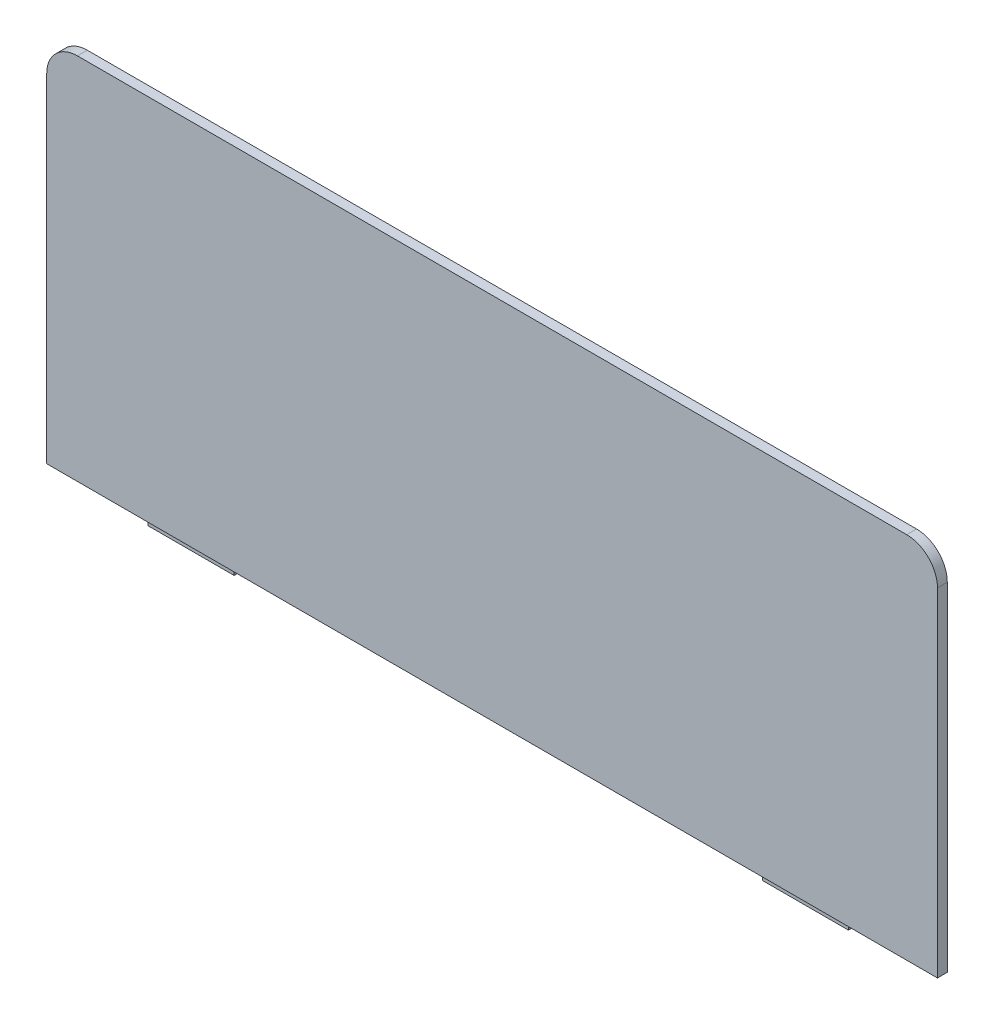
ISO-10303-21;
HEADER;
FILE_DESCRIPTION(('STEP AP214'),'2;1');
FILE_NAME('part.step','',(''),(''),'','','');
FILE_SCHEMA(('AUTOMOTIVE_DESIGN { 1 0 10303 214 1 1 1 1 }'));
ENDSEC;
DATA;
#1=APPLICATION_CONTEXT('core data for automotive mechanical design processes');
#2=APPLICATION_PROTOCOL_DEFINITION('international standard','automotive_design',2000,#1);
#3=PRODUCT_CONTEXT('',#1,'mechanical');
#4=PRODUCT('Part','Part','',(#3));
#5=PRODUCT_RELATED_PRODUCT_CATEGORY('part','',(#4));
#6=PRODUCT_DEFINITION_FORMATION('','',#4);
#7=PRODUCT_DEFINITION_CONTEXT('part definition',#1,'design');
#8=PRODUCT_DEFINITION('design','',#6,#7);
#9=PRODUCT_DEFINITION_SHAPE('','',#8);
#10=(LENGTH_UNIT() NAMED_UNIT(*) SI_UNIT(.MILLI.,.METRE.));
#11=(NAMED_UNIT(*) PLANE_ANGLE_UNIT() SI_UNIT($,.RADIAN.));
#12=(NAMED_UNIT(*) SI_UNIT($,.STERADIAN.) SOLID_ANGLE_UNIT());
#13=UNCERTAINTY_MEASURE_WITH_UNIT(LENGTH_MEASURE(1.E-05),#10,'distance_accuracy_value','');
#14=(GEOMETRIC_REPRESENTATION_CONTEXT(3) GLOBAL_UNCERTAINTY_ASSIGNED_CONTEXT((#13)) GLOBAL_UNIT_ASSIGNED_CONTEXT((#10,
#11,#12)) REPRESENTATION_CONTEXT('',''));
#15=CARTESIAN_POINT('',(0.,0.,0.));
#16=DIRECTION('',(0.,0.,1.));
#17=DIRECTION('',(1.,0.,0.));
#18=AXIS2_PLACEMENT_3D('',#15,#16,#17);
#19=CARTESIAN_POINT('',(123.79746835443,62.3768855076304,3.2));
#20=DIRECTION('',(-1.,0.,0.));
#21=DIRECTION('',(0.,-1.,0.));
#22=AXIS2_PLACEMENT_3D('',#19,#20,#21);
#23=PLANE('',#22);
#24=DIRECTION('',(0.,1.,0.));
#25=VECTOR('',#24,1.);
#26=CARTESIAN_POINT('',(123.79746835443,62.3768855076304,0.));
#27=LINE('',#26,#25);
#28=CARTESIAN_POINT('',(123.79746835443,-47.6231144923696,0.));
#29=VERTEX_POINT('',#28);
#30=CARTESIAN_POINT('',(123.79746835443,62.3768855076304,0.));
#31=VERTEX_POINT('',#30);
#32=EDGE_CURVE('E289',#29,#31,#27,.T.);
#33=ORIENTED_EDGE('',*,*,#32,.T.);
#34=DIRECTION('',(0.,0.,-1.));
#35=VECTOR('',#34,1.);
#36=CARTESIAN_POINT('',(123.79746835443,62.3768855076304,3.2));
#37=LINE('',#36,#35);
#38=CARTESIAN_POINT('',(123.79746835443,62.3768855076304,3.2));
#39=VERTEX_POINT('',#38);
#40=EDGE_CURVE('E41',#39,#31,#37,.T.);
#41=ORIENTED_EDGE('',*,*,#40,.F.);
#42=DIRECTION('',(0.,1.,0.));
#43=VECTOR('',#42,1.);
#44=CARTESIAN_POINT('',(123.79746835443,62.3768855076304,3.2));
#45=LINE('',#44,#43);
#46=CARTESIAN_POINT('',(123.79746835443,-47.6231144923696,3.2));
#47=VERTEX_POINT('',#46);
#48=EDGE_CURVE('E274',#47,#39,#45,.T.);
#49=ORIENTED_EDGE('',*,*,#48,.F.);
#50=DIRECTION('',(0.,0.,-1.));
#51=VECTOR('',#50,1.);
#52=CARTESIAN_POINT('',(123.79746835443,-47.6231144923696,3.2));
#53=LINE('',#52,#51);
#54=EDGE_CURVE('E11',#47,#29,#53,.T.);
#55=ORIENTED_EDGE('',*,*,#54,.T.);
#56=EDGE_LOOP('',(#33,#41,#49,#55));
#57=FACE_BOUND('',#56,.T.);
#58=ADVANCED_FACE('F33',(#57),#23,.F.);
#59=CARTESIAN_POINT('',(113.79746835443,62.3768855076304,3.2));
#60=DIRECTION('',(0.,0.,-1.));
#61=DIRECTION('',(-1.,0.,0.));
#62=AXIS2_PLACEMENT_3D('',#59,#60,#61);
#63=CYLINDRICAL_SURFACE('',#62,10.);
#64=CARTESIAN_POINT('',(113.79746835443,62.3768855076304,0.));
#65=DIRECTION('',(0.,0.,1.));
#66=DIRECTION('',(-1.,0.,0.));
#67=AXIS2_PLACEMENT_3D('',#64,#65,#66);
#68=CIRCLE('',#67,10.);
#69=CARTESIAN_POINT('',(113.79746835443,72.3768855076304,0.));
#70=VERTEX_POINT('',#69);
#71=EDGE_CURVE('E291',#31,#70,#68,.T.);
#72=ORIENTED_EDGE('',*,*,#71,.T.);
#73=DIRECTION('',(0.,0.,-1.));
#74=VECTOR('',#73,1.);
#75=CARTESIAN_POINT('',(113.79746835443,72.3768855076304,3.2));
#76=LINE('',#75,#74);
#77=CARTESIAN_POINT('',(113.79746835443,72.3768855076304,3.2));
#78=VERTEX_POINT('',#77);
#79=EDGE_CURVE('E346',#78,#70,#76,.T.);
#80=ORIENTED_EDGE('',*,*,#79,.F.);
#81=CARTESIAN_POINT('',(113.79746835443,62.3768855076304,3.2));
#82=DIRECTION('',(0.,0.,1.));
#83=DIRECTION('',(-1.,0.,0.));
#84=AXIS2_PLACEMENT_3D('',#81,#82,#83);
#85=CIRCLE('',#84,10.);
#86=EDGE_CURVE('E277',#39,#78,#85,.T.);
#87=ORIENTED_EDGE('',*,*,#86,.F.);
#88=ORIENTED_EDGE('',*,*,#40,.T.);
#89=EDGE_LOOP('',(#72,#80,#87,#88));
#90=FACE_BOUND('',#89,.T.);
#91=ADVANCED_FACE('F354',(#90),#63,.T.);
#92=CARTESIAN_POINT('',(-156.20253164557,72.3768855076304,3.2));
#93=DIRECTION('',(0.,-1.,0.));
#94=DIRECTION('',(1.,0.,0.));
#95=AXIS2_PLACEMENT_3D('',#92,#93,#94);
#96=PLANE('',#95);
#97=DIRECTION('',(-1.,0.,0.));
#98=VECTOR('',#97,1.);
#99=CARTESIAN_POINT('',(-156.20253164557,72.3768855076304,0.));
#100=LINE('',#99,#98);
#101=CARTESIAN_POINT('',(-156.20253164557,72.3768855076304,0.));
#102=VERTEX_POINT('',#101);
#103=EDGE_CURVE('E293',#70,#102,#100,.T.);
#104=ORIENTED_EDGE('',*,*,#103,.T.);
#105=DIRECTION('',(0.,0.,-1.));
#106=VECTOR('',#105,1.);
#107=CARTESIAN_POINT('',(-156.20253164557,72.3768855076304,3.2));
#108=LINE('',#107,#106);
#109=CARTESIAN_POINT('',(-156.20253164557,72.3768855076304,3.2));
#110=VERTEX_POINT('',#109);
#111=EDGE_CURVE('E343',#110,#102,#108,.T.);
#112=ORIENTED_EDGE('',*,*,#111,.F.);
#113=DIRECTION('',(-1.,0.,0.));
#114=VECTOR('',#113,1.);
#115=CARTESIAN_POINT('',(-156.20253164557,72.3768855076304,3.2));
#116=LINE('',#115,#114);
#117=EDGE_CURVE('E279',#78,#110,#116,.T.);
#118=ORIENTED_EDGE('',*,*,#117,.F.);
#119=ORIENTED_EDGE('',*,*,#79,.T.);
#120=EDGE_LOOP('',(#104,#112,#118,#119));
#121=FACE_BOUND('',#120,.T.);
#122=ADVANCED_FACE('F365',(#121),#96,.F.);
#123=CARTESIAN_POINT('',(-156.20253164557,62.3768855076304,3.2));
#124=DIRECTION('',(0.,0.,-1.));
#125=DIRECTION('',(-1.,0.,0.));
#126=AXIS2_PLACEMENT_3D('',#123,#124,#125);
#127=CYLINDRICAL_SURFACE('',#126,10.);
#128=CARTESIAN_POINT('',(-156.20253164557,62.3768855076304,0.));
#129=DIRECTION('',(0.,0.,1.));
#130=DIRECTION('',(1.,0.,0.));
#131=AXIS2_PLACEMENT_3D('',#128,#129,#130);
#132=CIRCLE('',#131,10.);
#133=CARTESIAN_POINT('',(-166.20253164557,62.3768855076304,0.));
#134=VERTEX_POINT('',#133);
#135=EDGE_CURVE('E295',#102,#134,#132,.T.);
#136=ORIENTED_EDGE('',*,*,#135,.T.);
#137=DIRECTION('',(0.,0.,-1.));
#138=VECTOR('',#137,1.);
#139=CARTESIAN_POINT('',(-166.20253164557,62.3768855076304,3.2));
#140=LINE('',#139,#138);
#141=CARTESIAN_POINT('',(-166.20253164557,62.3768855076304,3.2));
#142=VERTEX_POINT('',#141);
#143=EDGE_CURVE('E340',#142,#134,#140,.T.);
#144=ORIENTED_EDGE('',*,*,#143,.F.);
#145=CARTESIAN_POINT('',(-156.20253164557,62.3768855076304,3.2));
#146=DIRECTION('',(0.,0.,1.));
#147=DIRECTION('',(1.,0.,0.));
#148=AXIS2_PLACEMENT_3D('',#145,#146,#147);
#149=CIRCLE('',#148,10.);
#150=EDGE_CURVE('E281',#110,#142,#149,.T.);
#151=ORIENTED_EDGE('',*,*,#150,.F.);
#152=ORIENTED_EDGE('',*,*,#111,.T.);
#153=EDGE_LOOP('',(#136,#144,#151,#152));
#154=FACE_BOUND('',#153,.T.);
#155=ADVANCED_FACE('F369',(#154),#127,.T.);
#156=CARTESIAN_POINT('',(-166.20253164557,62.3768855076304,3.2));
#157=DIRECTION('',(1.,0.,0.));
#158=DIRECTION('',(0.,1.,0.));
#159=AXIS2_PLACEMENT_3D('',#156,#157,#158);
#160=PLANE('',#159);
#161=DIRECTION('',(0.,-1.,0.));
#162=VECTOR('',#161,1.);
#163=CARTESIAN_POINT('',(-166.20253164557,62.3768855076304,0.));
#164=LINE('',#163,#162);
#165=CARTESIAN_POINT('',(-166.20253164557,-47.6231144923696,0.));
#166=VERTEX_POINT('',#165);
#167=EDGE_CURVE('E297',#134,#166,#164,.T.);
#168=ORIENTED_EDGE('',*,*,#167,.T.);
#169=DIRECTION('',(0.,0.,-1.));
#170=VECTOR('',#169,1.);
#171=CARTESIAN_POINT('',(-166.20253164557,-47.6231144923696,3.2));
#172=LINE('',#171,#170);
#173=CARTESIAN_POINT('',(-166.20253164557,-47.6231144923696,3.2));
#174=VERTEX_POINT('',#173);
#175=EDGE_CURVE('E337',#174,#166,#172,.T.);
#176=ORIENTED_EDGE('',*,*,#175,.F.);
#177=DIRECTION('',(0.,-1.,0.));
#178=VECTOR('',#177,1.);
#179=CARTESIAN_POINT('',(-166.20253164557,62.3768855076304,3.2));
#180=LINE('',#179,#178);
#181=EDGE_CURVE('E283',#142,#174,#180,.T.);
#182=ORIENTED_EDGE('',*,*,#181,.F.);
#183=ORIENTED_EDGE('',*,*,#143,.T.);
#184=EDGE_LOOP('',(#168,#176,#182,#183));
#185=FACE_BOUND('',#184,.T.);
#186=ADVANCED_FACE('F415',(#185),#160,.F.);
#187=CARTESIAN_POINT('',(-135.20253164557,-47.6231144923696,3.2));
#188=DIRECTION('',(1.,0.,0.));
#189=DIRECTION('',(0.,1.,0.));
#190=AXIS2_PLACEMENT_3D('',#187,#188,#189);
#191=PLANE('',#190);
#192=DIRECTION('',(0.,0.,-1.));
#193=VECTOR('',#192,1.);
#194=CARTESIAN_POINT('',(-135.20253164557,-50.6231144923696,3.2));
#195=LINE('',#194,#193);
#196=CARTESIAN_POINT('',(-135.20253164557,-50.6231144923696,1.2));
#197=VERTEX_POINT('',#196);
#198=CARTESIAN_POINT('',(-135.20253164557,-50.6231144923696,0.));
#199=VERTEX_POINT('',#198);
#200=EDGE_CURVE('E333',#197,#199,#195,.T.);
#201=ORIENTED_EDGE('',*,*,#200,.F.);
#202=DIRECTION('',(0.,-1.,0.));
#203=VECTOR('',#202,1.);
#204=CARTESIAN_POINT('',(-135.20253164557,-50.6231144923696,1.2));
#205=LINE('',#204,#203);
#206=CARTESIAN_POINT('',(-135.20253164557,-47.6231144923696,1.2));
#207=VERTEX_POINT('',#206);
#208=EDGE_CURVE('E255',#207,#197,#205,.T.);
#209=ORIENTED_EDGE('',*,*,#208,.F.);
#210=DIRECTION('',(0.,0.,-1.));
#211=VECTOR('',#210,1.);
#212=CARTESIAN_POINT('',(-135.20253164557,-47.6231144923696,3.2));
#213=LINE('',#212,#211);
#214=CARTESIAN_POINT('',(-135.20253164557,-47.6231144923696,0.));
#215=VERTEX_POINT('',#214);
#216=EDGE_CURVE('E335',#207,#215,#213,.T.);
#217=ORIENTED_EDGE('',*,*,#216,.T.);
#218=DIRECTION('',(0.,-1.,0.));
#219=VECTOR('',#218,1.);
#220=CARTESIAN_POINT('',(-135.20253164557,-47.6231144923696,0.));
#221=LINE('',#220,#219);
#222=EDGE_CURVE('E302',#215,#199,#221,.T.);
#223=ORIENTED_EDGE('',*,*,#222,.T.);
#224=EDGE_LOOP('',(#201,#209,#217,#223));
#225=FACE_BOUND('',#224,.T.);
#226=ADVANCED_FACE('F412',(#225),#191,.F.);
#227=CARTESIAN_POINT('',(-135.20253164557,-50.6231144923696,3.2));
#228=DIRECTION('',(0.,1.,0.));
#229=DIRECTION('',(-1.,0.,0.));
#230=AXIS2_PLACEMENT_3D('',#227,#228,#229);
#231=PLANE('',#230);
#232=DIRECTION('',(0.,0.,-1.));
#233=VECTOR('',#232,1.);
#234=CARTESIAN_POINT('',(-107.20253164557,-50.6231144923696,3.2));
#235=LINE('',#234,#233);
#236=CARTESIAN_POINT('',(-107.20253164557,-50.6231144923696,1.2));
#237=VERTEX_POINT('',#236);
#238=CARTESIAN_POINT('',(-107.20253164557,-50.6231144923696,0.));
#239=VERTEX_POINT('',#238);
#240=EDGE_CURVE('E331',#237,#239,#235,.T.);
#241=ORIENTED_EDGE('',*,*,#240,.F.);
#242=DIRECTION('',(1.,0.,0.));
#243=VECTOR('',#242,1.);
#244=CARTESIAN_POINT('',(-135.20253164557,-50.6231144923696,1.2));
#245=LINE('',#244,#243);
#246=EDGE_CURVE('E257',#197,#237,#245,.T.);
#247=ORIENTED_EDGE('',*,*,#246,.F.);
#248=ORIENTED_EDGE('',*,*,#200,.T.);
#249=DIRECTION('',(1.,0.,0.));
#250=VECTOR('',#249,1.);
#251=CARTESIAN_POINT('',(-135.20253164557,-50.6231144923696,0.));
#252=LINE('',#251,#250);
#253=EDGE_CURVE('E305',#199,#239,#252,.T.);
#254=ORIENTED_EDGE('',*,*,#253,.T.);
#255=EDGE_LOOP('',(#241,#247,#248,#254));
#256=FACE_BOUND('',#255,.T.);
#257=ADVANCED_FACE('F407',(#256),#231,.F.);
#258=CARTESIAN_POINT('',(-107.20253164557,-47.6231144923696,3.2));
#259=DIRECTION('',(-1.,0.,0.));
#260=DIRECTION('',(0.,-1.,0.));
#261=AXIS2_PLACEMENT_3D('',#258,#259,#260);
#262=PLANE('',#261);
#263=DIRECTION('',(0.,0.,-1.));
#264=VECTOR('',#263,1.);
#265=CARTESIAN_POINT('',(-107.20253164557,-47.6231144923696,3.2));
#266=LINE('',#265,#264);
#267=CARTESIAN_POINT('',(-107.20253164557,-47.6231144923696,1.2));
#268=VERTEX_POINT('',#267);
#269=CARTESIAN_POINT('',(-107.20253164557,-47.6231144923696,0.));
#270=VERTEX_POINT('',#269);
#271=EDGE_CURVE('E329',#268,#270,#266,.T.);
#272=ORIENTED_EDGE('',*,*,#271,.F.);
#273=DIRECTION('',(0.,1.,0.));
#274=VECTOR('',#273,1.);
#275=CARTESIAN_POINT('',(-107.20253164557,-50.6231144923696,1.2));
#276=LINE('',#275,#274);
#277=EDGE_CURVE('E260',#237,#268,#276,.T.);
#278=ORIENTED_EDGE('',*,*,#277,.F.);
#279=ORIENTED_EDGE('',*,*,#240,.T.);
#280=DIRECTION('',(0.,1.,0.));
#281=VECTOR('',#280,1.);
#282=CARTESIAN_POINT('',(-107.20253164557,-47.6231144923696,0.));
#283=LINE('',#282,#281);
#284=EDGE_CURVE('E308',#239,#270,#283,.T.);
#285=ORIENTED_EDGE('',*,*,#284,.T.);
#286=EDGE_LOOP('',(#272,#278,#279,#285));
#287=FACE_BOUND('',#286,.T.);
#288=ADVANCED_FACE('F403',(#287),#262,.F.);
#289=CARTESIAN_POINT('',(-107.20253164557,-47.6231144923696,3.2));
#290=DIRECTION('',(0.,1.,0.));
#291=DIRECTION('',(-1.,0.,0.));
#292=AXIS2_PLACEMENT_3D('',#289,#290,#291);
#293=PLANE('',#292);
#294=DIRECTION('',(1.,0.,0.));
#295=VECTOR('',#294,1.);
#296=CARTESIAN_POINT('',(-107.20253164557,-47.6231144923696,0.));
#297=LINE('',#296,#295);
#298=CARTESIAN_POINT('',(64.7974683544304,-47.6231144923696,0.));
#299=VERTEX_POINT('',#298);
#300=EDGE_CURVE('E311',#270,#299,#297,.T.);
#301=ORIENTED_EDGE('',*,*,#300,.T.);
#302=DIRECTION('',(0.,0.,-1.));
#303=VECTOR('',#302,1.);
#304=CARTESIAN_POINT('',(64.7974683544304,-47.6231144923696,3.2));
#305=LINE('',#304,#303);
#306=CARTESIAN_POINT('',(64.7974683544304,-47.6231144923696,1.2));
#307=VERTEX_POINT('',#306);
#308=EDGE_CURVE('E327',#307,#299,#305,.T.);
#309=ORIENTED_EDGE('',*,*,#308,.F.);
#310=DIRECTION('',(-1.,0.,0.));
#311=VECTOR('',#310,1.);
#312=CARTESIAN_POINT('',(64.7974683544304,-47.6231144923696,1.2));
#313=LINE('',#312,#311);
#314=CARTESIAN_POINT('',(92.7974683544304,-47.6231144923696,1.2));
#315=VERTEX_POINT('',#314);
#316=EDGE_CURVE('E258',#315,#307,#313,.T.);
#317=ORIENTED_EDGE('',*,*,#316,.F.);
#318=DIRECTION('',(0.,0.,-1.));
#319=VECTOR('',#318,1.);
#320=CARTESIAN_POINT('',(92.7974683544304,-47.6231144923696,3.2));
#321=LINE('',#320,#319);
#322=CARTESIAN_POINT('',(92.7974683544304,-47.6231144923696,0.));
#323=VERTEX_POINT('',#322);
#324=EDGE_CURVE('E286',#315,#323,#321,.T.);
#325=ORIENTED_EDGE('',*,*,#324,.T.);
#326=DIRECTION('',(1.,0.,0.));
#327=VECTOR('',#326,1.);
#328=CARTESIAN_POINT('',(92.7974683544304,-47.6231144923696,0.));
#329=LINE('',#328,#327);
#330=EDGE_CURVE('E264',#323,#29,#329,.T.);
#331=ORIENTED_EDGE('',*,*,#330,.T.);
#332=ORIENTED_EDGE('',*,*,#54,.F.);
#333=DIRECTION('',(1.,0.,0.));
#334=VECTOR('',#333,1.);
#335=CARTESIAN_POINT('',(92.7974683544304,-47.6231144923696,3.2));
#336=LINE('',#335,#334);
#337=EDGE_CURVE('E271',#174,#47,#336,.T.);
#338=ORIENTED_EDGE('',*,*,#337,.F.);
#339=ORIENTED_EDGE('',*,*,#175,.T.);
#340=DIRECTION('',(1.,0.,0.));
#341=VECTOR('',#340,1.);
#342=CARTESIAN_POINT('',(-166.20253164557,-47.6231144923696,0.));
#343=LINE('',#342,#341);
#344=EDGE_CURVE('E299',#166,#215,#343,.T.);
#345=ORIENTED_EDGE('',*,*,#344,.T.);
#346=ORIENTED_EDGE('',*,*,#216,.F.);
#347=DIRECTION('',(-1.,0.,0.));
#348=VECTOR('',#347,1.);
#349=CARTESIAN_POINT('',(-135.20253164557,-47.6231144923696,1.2));
#350=LINE('',#349,#348);
#351=EDGE_CURVE('E262',#268,#207,#350,.T.);
#352=ORIENTED_EDGE('',*,*,#351,.F.);
#353=ORIENTED_EDGE('',*,*,#271,.T.);
#354=EDGE_LOOP('',(#301,#309,#317,#325,#331,#332,#338,#339,#345,#346,#352,#353));
#355=FACE_BOUND('',#354,.T.);
#356=ADVANCED_FACE('F377',(#355),#293,.F.);
#357=CARTESIAN_POINT('',(64.7974683544304,-47.6231144923696,3.2));
#358=DIRECTION('',(1.,0.,0.));
#359=DIRECTION('',(0.,0.,-1.));
#360=AXIS2_PLACEMENT_3D('',#357,#358,#359);
#361=PLANE('',#360);
#362=DIRECTION('',(0.,0.,-1.));
#363=VECTOR('',#362,1.);
#364=CARTESIAN_POINT('',(64.7974683544304,-50.6231144923696,3.2));
#365=LINE('',#364,#363);
#366=CARTESIAN_POINT('',(64.7974683544304,-50.6231144923696,1.2));
#367=VERTEX_POINT('',#366);
#368=CARTESIAN_POINT('',(64.7974683544304,-50.6231144923696,0.));
#369=VERTEX_POINT('',#368);
#370=EDGE_CURVE('E325',#367,#369,#365,.T.);
#371=ORIENTED_EDGE('',*,*,#370,.F.);
#372=DIRECTION('',(0.,-1.,0.));
#373=VECTOR('',#372,1.);
#374=CARTESIAN_POINT('',(64.7974683544304,-50.6231144923696,1.2));
#375=LINE('',#374,#373);
#376=EDGE_CURVE('E246',#307,#367,#375,.T.);
#377=ORIENTED_EDGE('',*,*,#376,.F.);
#378=ORIENTED_EDGE('',*,*,#308,.T.);
#379=DIRECTION('',(0.,-1.,0.));
#380=VECTOR('',#379,1.);
#381=CARTESIAN_POINT('',(64.7974683544304,-47.6231144923696,0.));
#382=LINE('',#381,#380);
#383=EDGE_CURVE('E314',#299,#369,#382,.T.);
#384=ORIENTED_EDGE('',*,*,#383,.T.);
#385=EDGE_LOOP('',(#371,#377,#378,#384));
#386=FACE_BOUND('',#385,.T.);
#387=ADVANCED_FACE('F393',(#386),#361,.F.);
#388=CARTESIAN_POINT('',(92.7974683544304,-50.6231144923696,3.2));
#389=DIRECTION('',(0.,1.,0.));
#390=DIRECTION('',(0.,0.,1.));
#391=AXIS2_PLACEMENT_3D('',#388,#389,#390);
#392=PLANE('',#391);
#393=DIRECTION('',(0.,0.,-1.));
#394=VECTOR('',#393,1.);
#395=CARTESIAN_POINT('',(92.7974683544304,-50.6231144923696,3.2));
#396=LINE('',#395,#394);
#397=CARTESIAN_POINT('',(92.7974683544304,-50.6231144923696,1.2));
#398=VERTEX_POINT('',#397);
#399=CARTESIAN_POINT('',(92.7974683544304,-50.6231144923696,0.));
#400=VERTEX_POINT('',#399);
#401=EDGE_CURVE('E323',#398,#400,#396,.T.);
#402=ORIENTED_EDGE('',*,*,#401,.F.);
#403=DIRECTION('',(1.,0.,0.));
#404=VECTOR('',#403,1.);
#405=CARTESIAN_POINT('',(64.7974683544304,-50.6231144923696,1.2));
#406=LINE('',#405,#404);
#407=EDGE_CURVE('E266',#367,#398,#406,.T.);
#408=ORIENTED_EDGE('',*,*,#407,.F.);
#409=ORIENTED_EDGE('',*,*,#370,.T.);
#410=DIRECTION('',(1.,0.,0.));
#411=VECTOR('',#410,1.);
#412=CARTESIAN_POINT('',(92.7974683544304,-50.6231144923696,0.));
#413=LINE('',#412,#411);
#414=EDGE_CURVE('E317',#369,#400,#413,.T.);
#415=ORIENTED_EDGE('',*,*,#414,.T.);
#416=EDGE_LOOP('',(#402,#408,#409,#415));
#417=FACE_BOUND('',#416,.T.);
#418=ADVANCED_FACE('F389',(#417),#392,.F.);
#419=CARTESIAN_POINT('',(92.7974683544304,-47.6231144923696,3.2));
#420=DIRECTION('',(-1.,0.,0.));
#421=DIRECTION('',(0.,0.,1.));
#422=AXIS2_PLACEMENT_3D('',#419,#420,#421);
#423=PLANE('',#422);
#424=ORIENTED_EDGE('',*,*,#324,.F.);
#425=DIRECTION('',(0.,1.,0.));
#426=VECTOR('',#425,1.);
#427=CARTESIAN_POINT('',(92.7974683544304,-50.6231144923696,1.2));
#428=LINE('',#427,#426);
#429=EDGE_CURVE('E268',#398,#315,#428,.T.);
#430=ORIENTED_EDGE('',*,*,#429,.F.);
#431=ORIENTED_EDGE('',*,*,#401,.T.);
#432=DIRECTION('',(0.,1.,0.));
#433=VECTOR('',#432,1.);
#434=CARTESIAN_POINT('',(92.7974683544304,-47.6231144923696,0.));
#435=LINE('',#434,#433);
#436=EDGE_CURVE('E275',#400,#323,#435,.T.);
#437=ORIENTED_EDGE('',*,*,#436,.T.);
#438=EDGE_LOOP('',(#424,#430,#431,#437));
#439=FACE_BOUND('',#438,.T.);
#440=ADVANCED_FACE('F384',(#439),#423,.F.);
#441=CARTESIAN_POINT('',(113.79746835443,62.3768855076304,3.2));
#442=DIRECTION('',(0.,0.,-1.));
#443=DIRECTION('',(-1.,0.,0.));
#444=AXIS2_PLACEMENT_3D('',#441,#442,#443);
#445=PLANE('',#444);
#446=ORIENTED_EDGE('',*,*,#181,.T.);
#447=ORIENTED_EDGE('',*,*,#337,.T.);
#448=ORIENTED_EDGE('',*,*,#48,.T.);
#449=ORIENTED_EDGE('',*,*,#86,.T.);
#450=ORIENTED_EDGE('',*,*,#117,.T.);
#451=ORIENTED_EDGE('',*,*,#150,.T.);
#452=EDGE_LOOP('',(#446,#447,#448,#449,#450,#451));
#453=FACE_BOUND('',#452,.T.);
#454=ADVANCED_FACE('F373',(#453),#445,.F.);
#455=CARTESIAN_POINT('',(113.79746835443,62.3768855076304,0.));
#456=DIRECTION('',(0.,0.,-1.));
#457=DIRECTION('',(-1.,0.,0.));
#458=AXIS2_PLACEMENT_3D('',#455,#456,#457);
#459=PLANE('',#458);
#460=DIRECTION('',(0.,1.,0.));
#461=VECTOR('',#460,1.);
#462=CARTESIAN_POINT('',(89.9974683544304,19.3768855076304,0.));
#463=LINE('',#462,#461);
#464=CARTESIAN_POINT('',(89.9974683544304,7.3768855076304,0.));
#465=VERTEX_POINT('',#464);
#466=CARTESIAN_POINT('',(89.9974683544304,19.3768855076304,0.));
#467=VERTEX_POINT('',#466);
#468=EDGE_CURVE('E214',#465,#467,#463,.T.);
#469=ORIENTED_EDGE('',*,*,#468,.T.);
#470=DIRECTION('',(-1.,0.,0.));
#471=VECTOR('',#470,1.);
#472=CARTESIAN_POINT('',(89.9974683544304,19.3768855076304,0.));
#473=LINE('',#472,#471);
#474=CARTESIAN_POINT('',(84.9974683544304,19.3768855076304,0.));
#475=VERTEX_POINT('',#474);
#476=EDGE_CURVE('E187',#467,#475,#473,.T.);
#477=ORIENTED_EDGE('',*,*,#476,.T.);
#478=DIRECTION('',(0.,-1.,0.));
#479=VECTOR('',#478,1.);
#480=CARTESIAN_POINT('',(84.9974683544304,19.3768855076304,0.));
#481=LINE('',#480,#479);
#482=CARTESIAN_POINT('',(84.9974683544304,7.3768855076304,0.));
#483=VERTEX_POINT('',#482);
#484=EDGE_CURVE('E53',#475,#483,#481,.T.);
#485=ORIENTED_EDGE('',*,*,#484,.T.);
#486=DIRECTION('',(1.,0.,0.));
#487=VECTOR('',#486,1.);
#488=CARTESIAN_POINT('',(89.9974683544304,7.3768855076304,0.));
#489=LINE('',#488,#487);
#490=EDGE_CURVE('E48',#483,#465,#489,.T.);
#491=ORIENTED_EDGE('',*,*,#490,.T.);
#492=EDGE_LOOP('',(#469,#477,#485,#491));
#493=FACE_BOUND('',#492,.T.);
#494=DIRECTION('',(0.,-1.,0.));
#495=VECTOR('',#494,1.);
#496=CARTESIAN_POINT('',(-132.40253164557,19.3768855076304,0.));
#497=LINE('',#496,#495);
#498=CARTESIAN_POINT('',(-132.40253164557,19.3768855076304,0.));
#499=VERTEX_POINT('',#498);
#500=CARTESIAN_POINT('',(-132.40253164557,7.3768855076304,0.));
#501=VERTEX_POINT('',#500);
#502=EDGE_CURVE('E219',#499,#501,#497,.T.);
#503=ORIENTED_EDGE('',*,*,#502,.T.);
#504=DIRECTION('',(1.,0.,0.));
#505=VECTOR('',#504,1.);
#506=CARTESIAN_POINT('',(-132.40253164557,7.3768855076304,0.));
#507=LINE('',#506,#505);
#508=CARTESIAN_POINT('',(-127.40253164557,7.3768855076304,0.));
#509=VERTEX_POINT('',#508);
#510=EDGE_CURVE('E238',#501,#509,#507,.T.);
#511=ORIENTED_EDGE('',*,*,#510,.T.);
#512=DIRECTION('',(0.,1.,0.));
#513=VECTOR('',#512,1.);
#514=CARTESIAN_POINT('',(-127.40253164557,19.3768855076304,0.));
#515=LINE('',#514,#513);
#516=CARTESIAN_POINT('',(-127.40253164557,19.3768855076304,0.));
#517=VERTEX_POINT('',#516);
#518=EDGE_CURVE('E240',#509,#517,#515,.T.);
#519=ORIENTED_EDGE('',*,*,#518,.T.);
#520=DIRECTION('',(-1.,0.,0.));
#521=VECTOR('',#520,1.);
#522=CARTESIAN_POINT('',(-132.40253164557,19.3768855076304,0.));
#523=LINE('',#522,#521);
#524=EDGE_CURVE('E227',#517,#499,#523,.T.);
#525=ORIENTED_EDGE('',*,*,#524,.T.);
#526=EDGE_LOOP('',(#503,#511,#519,#525));
#527=FACE_BOUND('',#526,.T.);
#528=ORIENTED_EDGE('',*,*,#330,.F.);
#529=ORIENTED_EDGE('',*,*,#436,.F.);
#530=ORIENTED_EDGE('',*,*,#414,.F.);
#531=ORIENTED_EDGE('',*,*,#383,.F.);
#532=ORIENTED_EDGE('',*,*,#300,.F.);
#533=ORIENTED_EDGE('',*,*,#284,.F.);
#534=ORIENTED_EDGE('',*,*,#253,.F.);
#535=ORIENTED_EDGE('',*,*,#222,.F.);
#536=ORIENTED_EDGE('',*,*,#344,.F.);
#537=ORIENTED_EDGE('',*,*,#167,.F.);
#538=ORIENTED_EDGE('',*,*,#135,.F.);
#539=ORIENTED_EDGE('',*,*,#103,.F.);
#540=ORIENTED_EDGE('',*,*,#71,.F.);
#541=ORIENTED_EDGE('',*,*,#32,.F.);
#542=EDGE_LOOP('',(#528,#529,#530,#531,#532,#533,#534,#535,#536,#537,#538,#539,#540,#541));
#543=FACE_BOUND('',#542,.T.);
#544=ADVANCED_FACE('F360',(#493,#527,#543),#459,.T.);
#545=CARTESIAN_POINT('',(0.,0.,1.2));
#546=DIRECTION('',(0.,0.,-1.));
#547=DIRECTION('',(-1.,0.,0.));
#548=AXIS2_PLACEMENT_3D('',#545,#546,#547);
#549=PLANE('',#548);
#550=ORIENTED_EDGE('',*,*,#376,.T.);
#551=ORIENTED_EDGE('',*,*,#407,.T.);
#552=ORIENTED_EDGE('',*,*,#429,.T.);
#553=ORIENTED_EDGE('',*,*,#316,.T.);
#554=EDGE_LOOP('',(#550,#551,#552,#553));
#555=FACE_BOUND('',#554,.T.);
#556=ADVANCED_FACE('F514',(#555),#549,.F.);
#557=CARTESIAN_POINT('',(0.,0.,1.2));
#558=DIRECTION('',(0.,0.,-1.));
#559=DIRECTION('',(-1.,0.,0.));
#560=AXIS2_PLACEMENT_3D('',#557,#558,#559);
#561=PLANE('',#560);
#562=ORIENTED_EDGE('',*,*,#208,.T.);
#563=ORIENTED_EDGE('',*,*,#246,.T.);
#564=ORIENTED_EDGE('',*,*,#277,.T.);
#565=ORIENTED_EDGE('',*,*,#351,.T.);
#566=EDGE_LOOP('',(#562,#563,#564,#565));
#567=FACE_BOUND('',#566,.T.);
#568=ADVANCED_FACE('F518',(#567),#561,.F.);
#569=CARTESIAN_POINT('',(-132.40253164557,19.3768855076304,-7.));
#570=DIRECTION('',(-1.,0.,0.));
#571=DIRECTION('',(0.,0.,1.));
#572=AXIS2_PLACEMENT_3D('',#569,#570,#571);
#573=PLANE('',#572);
#574=ORIENTED_EDGE('',*,*,#502,.F.);
#575=DIRECTION('',(0.,0.,1.));
#576=VECTOR('',#575,1.);
#577=CARTESIAN_POINT('',(-132.40253164557,19.3768855076304,-7.));
#578=LINE('',#577,#576);
#579=CARTESIAN_POINT('',(-132.40253164557,19.3768855076304,-7.));
#580=VERTEX_POINT('',#579);
#581=EDGE_CURVE('E243',#580,#499,#578,.T.);
#582=ORIENTED_EDGE('',*,*,#581,.F.);
#583=DIRECTION('',(0.,-1.,0.));
#584=VECTOR('',#583,1.);
#585=CARTESIAN_POINT('',(-132.40253164557,19.3768855076304,-7.));
#586=LINE('',#585,#584);
#587=CARTESIAN_POINT('',(-132.40253164557,7.3768855076304,-7.));
#588=VERTEX_POINT('',#587);
#589=EDGE_CURVE('E223',#580,#588,#586,.T.);
#590=ORIENTED_EDGE('',*,*,#589,.T.);
#591=DIRECTION('',(0.,0.,1.));
#592=VECTOR('',#591,1.);
#593=CARTESIAN_POINT('',(-132.40253164557,7.3768855076304,-7.));
#594=LINE('',#593,#592);
#595=EDGE_CURVE('E236',#588,#501,#594,.T.);
#596=ORIENTED_EDGE('',*,*,#595,.T.);
#597=EDGE_LOOP('',(#574,#582,#590,#596));
#598=FACE_BOUND('',#597,.T.);
#599=ADVANCED_FACE('F528',(#598),#573,.T.);
#600=CARTESIAN_POINT('',(-132.40253164557,19.3768855076304,-7.));
#601=DIRECTION('',(0.,1.,0.));
#602=DIRECTION('',(0.,0.,1.));
#603=AXIS2_PLACEMENT_3D('',#600,#601,#602);
#604=PLANE('',#603);
#605=CARTESIAN_POINT('',(-129.90253164557,19.3768855076304,-4.5));
#606=DIRECTION('',(0.,-1.,0.));
#607=DIRECTION('',(0.,0.,-1.));
#608=AXIS2_PLACEMENT_3D('',#605,#606,#607);
#609=CIRCLE('',#608,1.);
#610=CARTESIAN_POINT('',(-129.90253164557,19.3768855076304,-5.5));
#611=VERTEX_POINT('',#610);
#612=EDGE_CURVE('E659',#611,#611,#609,.T.);
#613=ORIENTED_EDGE('',*,*,#612,.T.);
#614=EDGE_LOOP('',(#613));
#615=FACE_BOUND('',#614,.T.);
#616=ORIENTED_EDGE('',*,*,#524,.F.);
#617=DIRECTION('',(0.,0.,1.));
#618=VECTOR('',#617,1.);
#619=CARTESIAN_POINT('',(-127.40253164557,19.3768855076304,-7.));
#620=LINE('',#619,#618);
#621=CARTESIAN_POINT('',(-127.40253164557,19.3768855076304,-7.));
#622=VERTEX_POINT('',#621);
#623=EDGE_CURVE('E247',#622,#517,#620,.T.);
#624=ORIENTED_EDGE('',*,*,#623,.F.);
#625=DIRECTION('',(-1.,0.,0.));
#626=VECTOR('',#625,1.);
#627=CARTESIAN_POINT('',(-132.40253164557,19.3768855076304,-7.));
#628=LINE('',#627,#626);
#629=EDGE_CURVE('E233',#622,#580,#628,.T.);
#630=ORIENTED_EDGE('',*,*,#629,.T.);
#631=ORIENTED_EDGE('',*,*,#581,.T.);
#632=EDGE_LOOP('',(#616,#624,#630,#631));
#633=FACE_BOUND('',#632,.T.);
#634=ADVANCED_FACE('F545',(#615,#633),#604,.T.);
#635=CARTESIAN_POINT('',(-127.40253164557,19.3768855076304,-7.));
#636=DIRECTION('',(1.,0.,0.));
#637=DIRECTION('',(0.,0.,-1.));
#638=AXIS2_PLACEMENT_3D('',#635,#636,#637);
#639=PLANE('',#638);
#640=ORIENTED_EDGE('',*,*,#518,.F.);
#641=DIRECTION('',(0.,0.,1.));
#642=VECTOR('',#641,1.);
#643=CARTESIAN_POINT('',(-127.40253164557,7.3768855076304,-7.));
#644=LINE('',#643,#642);
#645=CARTESIAN_POINT('',(-127.40253164557,7.3768855076304,-7.));
#646=VERTEX_POINT('',#645);
#647=EDGE_CURVE('E250',#646,#509,#644,.T.);
#648=ORIENTED_EDGE('',*,*,#647,.F.);
#649=DIRECTION('',(0.,1.,0.));
#650=VECTOR('',#649,1.);
#651=CARTESIAN_POINT('',(-127.40253164557,19.3768855076304,-7.));
#652=LINE('',#651,#650);
#653=EDGE_CURVE('E230',#646,#622,#652,.T.);
#654=ORIENTED_EDGE('',*,*,#653,.T.);
#655=ORIENTED_EDGE('',*,*,#623,.T.);
#656=EDGE_LOOP('',(#640,#648,#654,#655));
#657=FACE_BOUND('',#656,.T.);
#658=ADVANCED_FACE('F553',(#657),#639,.T.);
#659=CARTESIAN_POINT('',(-132.40253164557,7.3768855076304,-7.));
#660=DIRECTION('',(0.,-1.,0.));
#661=DIRECTION('',(1.,0.,0.));
#662=AXIS2_PLACEMENT_3D('',#659,#660,#661);
#663=PLANE('',#662);
#664=CARTESIAN_POINT('',(-129.90253164557,7.3768855076304,-4.5));
#665=DIRECTION('',(0.,-1.,0.));
#666=DIRECTION('',(1.,0.,0.));
#667=AXIS2_PLACEMENT_3D('',#664,#665,#666);
#668=CIRCLE('',#667,1.);
#669=CARTESIAN_POINT('',(-128.90253164557,7.3768855076304,-4.5));
#670=VERTEX_POINT('',#669);
#671=EDGE_CURVE('E36',#670,#670,#668,.F.);
#672=ORIENTED_EDGE('',*,*,#671,.T.);
#673=EDGE_LOOP('',(#672));
#674=FACE_BOUND('',#673,.T.);
#675=ORIENTED_EDGE('',*,*,#510,.F.);
#676=ORIENTED_EDGE('',*,*,#595,.F.);
#677=DIRECTION('',(1.,0.,0.));
#678=VECTOR('',#677,1.);
#679=CARTESIAN_POINT('',(-132.40253164557,7.3768855076304,-7.));
#680=LINE('',#679,#678);
#681=EDGE_CURVE('E226',#588,#646,#680,.T.);
#682=ORIENTED_EDGE('',*,*,#681,.T.);
#683=ORIENTED_EDGE('',*,*,#647,.T.);
#684=EDGE_LOOP('',(#675,#676,#682,#683));
#685=FACE_BOUND('',#684,.T.);
#686=ADVANCED_FACE('F558',(#674,#685),#663,.T.);
#687=CARTESIAN_POINT('',(0.,0.,-7.));
#688=DIRECTION('',(0.,0.,1.));
#689=DIRECTION('',(1.,0.,0.));
#690=AXIS2_PLACEMENT_3D('',#687,#688,#689);
#691=PLANE('',#690);
#692=ORIENTED_EDGE('',*,*,#589,.F.);
#693=ORIENTED_EDGE('',*,*,#629,.F.);
#694=ORIENTED_EDGE('',*,*,#653,.F.);
#695=ORIENTED_EDGE('',*,*,#681,.F.);
#696=EDGE_LOOP('',(#692,#693,#694,#695));
#697=FACE_BOUND('',#696,.T.);
#698=ADVANCED_FACE('F566',(#697),#691,.F.);
#699=CARTESIAN_POINT('',(89.9974683544304,19.3768855076304,-7.));
#700=DIRECTION('',(1.,0.,0.));
#701=DIRECTION('',(0.,0.,-1.));
#702=AXIS2_PLACEMENT_3D('',#699,#700,#701);
#703=PLANE('',#702);
#704=ORIENTED_EDGE('',*,*,#468,.F.);
#705=DIRECTION('',(0.,0.,1.));
#706=VECTOR('',#705,1.);
#707=CARTESIAN_POINT('',(89.9974683544304,7.3768855076304,-7.));
#708=LINE('',#707,#706);
#709=CARTESIAN_POINT('',(89.9974683544304,7.3768855076304,-7.));
#710=VERTEX_POINT('',#709);
#711=EDGE_CURVE('E205',#710,#465,#708,.T.);
#712=ORIENTED_EDGE('',*,*,#711,.F.);
#713=DIRECTION('',(0.,1.,0.));
#714=VECTOR('',#713,1.);
#715=CARTESIAN_POINT('',(89.9974683544304,19.3768855076304,-7.));
#716=LINE('',#715,#714);
#717=CARTESIAN_POINT('',(89.9974683544304,19.3768855076304,-7.));
#718=VERTEX_POINT('',#717);
#719=EDGE_CURVE('E199',#710,#718,#716,.T.);
#720=ORIENTED_EDGE('',*,*,#719,.T.);
#721=DIRECTION('',(0.,0.,1.));
#722=VECTOR('',#721,1.);
#723=CARTESIAN_POINT('',(89.9974683544304,19.3768855076304,-7.));
#724=LINE('',#723,#722);
#725=EDGE_CURVE('E182',#718,#467,#724,.T.);
#726=ORIENTED_EDGE('',*,*,#725,.T.);
#727=EDGE_LOOP('',(#704,#712,#720,#726));
#728=FACE_BOUND('',#727,.T.);
#729=ADVANCED_FACE('F204',(#728),#703,.T.);
#730=CARTESIAN_POINT('',(89.9974683544304,7.3768855076304,-7.));
#731=DIRECTION('',(0.,-1.,0.));
#732=DIRECTION('',(1.,0.,0.));
#733=AXIS2_PLACEMENT_3D('',#730,#731,#732);
#734=PLANE('',#733);
#735=CARTESIAN_POINT('',(87.4974683544304,7.3768855076304,-4.5));
#736=DIRECTION('',(0.,-1.,0.));
#737=DIRECTION('',(1.,0.,0.));
#738=AXIS2_PLACEMENT_3D('',#735,#736,#737);
#739=CIRCLE('',#738,1.);
#740=CARTESIAN_POINT('',(88.4974683544304,7.3768855076304,-4.5));
#741=VERTEX_POINT('',#740);
#742=EDGE_CURVE('E209',#741,#741,#739,.F.);
#743=ORIENTED_EDGE('',*,*,#742,.T.);
#744=EDGE_LOOP('',(#743));
#745=FACE_BOUND('',#744,.T.);
#746=ORIENTED_EDGE('',*,*,#490,.F.);
#747=DIRECTION('',(0.,0.,1.));
#748=VECTOR('',#747,1.);
#749=CARTESIAN_POINT('',(84.9974683544304,7.3768855076304,-7.));
#750=LINE('',#749,#748);
#751=CARTESIAN_POINT('',(84.9974683544304,7.3768855076304,-7.));
#752=VERTEX_POINT('',#751);
#753=EDGE_CURVE('E220',#752,#483,#750,.T.);
#754=ORIENTED_EDGE('',*,*,#753,.F.);
#755=DIRECTION('',(1.,0.,0.));
#756=VECTOR('',#755,1.);
#757=CARTESIAN_POINT('',(89.9974683544304,7.3768855076304,-7.));
#758=LINE('',#757,#756);
#759=EDGE_CURVE('E192',#752,#710,#758,.T.);
#760=ORIENTED_EDGE('',*,*,#759,.T.);
#761=ORIENTED_EDGE('',*,*,#711,.T.);
#762=EDGE_LOOP('',(#746,#754,#760,#761));
#763=FACE_BOUND('',#762,.T.);
#764=ADVANCED_FACE('F580',(#745,#763),#734,.T.);
#765=CARTESIAN_POINT('',(84.9974683544304,19.3768855076304,-7.));
#766=DIRECTION('',(-1.,0.,0.));
#767=DIRECTION('',(0.,0.,1.));
#768=AXIS2_PLACEMENT_3D('',#765,#766,#767);
#769=PLANE('',#768);
#770=ORIENTED_EDGE('',*,*,#484,.F.);
#771=DIRECTION('',(0.,0.,1.));
#772=VECTOR('',#771,1.);
#773=CARTESIAN_POINT('',(84.9974683544304,19.3768855076304,-7.));
#774=LINE('',#773,#772);
#775=CARTESIAN_POINT('',(84.9974683544304,19.3768855076304,-7.));
#776=VERTEX_POINT('',#775);
#777=EDGE_CURVE('E191',#776,#475,#774,.T.);
#778=ORIENTED_EDGE('',*,*,#777,.F.);
#779=DIRECTION('',(0.,-1.,0.));
#780=VECTOR('',#779,1.);
#781=CARTESIAN_POINT('',(84.9974683544304,19.3768855076304,-7.));
#782=LINE('',#781,#780);
#783=EDGE_CURVE('E202',#776,#752,#782,.T.);
#784=ORIENTED_EDGE('',*,*,#783,.T.);
#785=ORIENTED_EDGE('',*,*,#753,.T.);
#786=EDGE_LOOP('',(#770,#778,#784,#785));
#787=FACE_BOUND('',#786,.T.);
#788=ADVANCED_FACE('F587',(#787),#769,.T.);
#789=CARTESIAN_POINT('',(89.9974683544304,19.3768855076304,-7.));
#790=DIRECTION('',(0.,1.,0.));
#791=DIRECTION('',(0.,0.,1.));
#792=AXIS2_PLACEMENT_3D('',#789,#790,#791);
#793=PLANE('',#792);
#794=CARTESIAN_POINT('',(87.4974683544304,19.3768855076304,-4.5));
#795=DIRECTION('',(0.,-1.,0.));
#796=DIRECTION('',(0.,0.,-1.));
#797=AXIS2_PLACEMENT_3D('',#794,#795,#796);
#798=CIRCLE('',#797,1.);
#799=CARTESIAN_POINT('',(87.4974683544304,19.3768855076304,-5.5));
#800=VERTEX_POINT('',#799);
#801=EDGE_CURVE('E660',#800,#800,#798,.T.);
#802=ORIENTED_EDGE('',*,*,#801,.T.);
#803=EDGE_LOOP('',(#802));
#804=FACE_BOUND('',#803,.T.);
#805=ORIENTED_EDGE('',*,*,#476,.F.);
#806=ORIENTED_EDGE('',*,*,#725,.F.);
#807=DIRECTION('',(-1.,0.,0.));
#808=VECTOR('',#807,1.);
#809=CARTESIAN_POINT('',(89.9974683544304,19.3768855076304,-7.));
#810=LINE('',#809,#808);
#811=EDGE_CURVE('E186',#718,#776,#810,.T.);
#812=ORIENTED_EDGE('',*,*,#811,.T.);
#813=ORIENTED_EDGE('',*,*,#777,.T.);
#814=EDGE_LOOP('',(#805,#806,#812,#813));
#815=FACE_BOUND('',#814,.T.);
#816=ADVANCED_FACE('F184',(#804,#815),#793,.T.);
#817=CARTESIAN_POINT('',(0.,0.,-7.));
#818=DIRECTION('',(0.,0.,-1.));
#819=DIRECTION('',(-1.,0.,0.));
#820=AXIS2_PLACEMENT_3D('',#817,#818,#819);
#821=PLANE('',#820);
#822=ORIENTED_EDGE('',*,*,#719,.F.);
#823=ORIENTED_EDGE('',*,*,#759,.F.);
#824=ORIENTED_EDGE('',*,*,#783,.F.);
#825=ORIENTED_EDGE('',*,*,#811,.F.);
#826=EDGE_LOOP('',(#822,#823,#824,#825));
#827=FACE_BOUND('',#826,.T.);
#828=ADVANCED_FACE('F197',(#827),#821,.T.);
#829=CARTESIAN_POINT('',(87.4974683544304,-50.6231144923696,-4.5));
#830=DIRECTION('',(0.,1.,0.));
#831=DIRECTION('',(0.,0.,1.));
#832=AXIS2_PLACEMENT_3D('',#829,#830,#831);
#833=CYLINDRICAL_SURFACE('',#832,1.);
#834=ORIENTED_EDGE('',*,*,#742,.F.);
#835=EDGE_LOOP('',(#834));
#836=FACE_BOUND('',#835,.T.);
#837=ORIENTED_EDGE('',*,*,#801,.F.);
#838=EDGE_LOOP('',(#837));
#839=FACE_BOUND('',#838,.T.);
#840=ADVANCED_FACE('F603',(#836,#839),#833,.F.);
#841=CARTESIAN_POINT('',(-129.90253164557,-50.6231144923696,-4.5));
#842=DIRECTION('',(0.,1.,0.));
#843=DIRECTION('',(0.,0.,1.));
#844=AXIS2_PLACEMENT_3D('',#841,#842,#843);
#845=CYLINDRICAL_SURFACE('',#844,1.);
#846=ORIENTED_EDGE('',*,*,#671,.F.);
#847=EDGE_LOOP('',(#846));
#848=FACE_BOUND('',#847,.T.);
#849=ORIENTED_EDGE('',*,*,#612,.F.);
#850=EDGE_LOOP('',(#849));
#851=FACE_BOUND('',#850,.T.);
#852=ADVANCED_FACE('F640',(#848,#851),#845,.F.);
#853=CLOSED_SHELL('',(#58,#91,#122,#155,#186,#226,#257,#288,#356,#387,#418,#440,#454,#544,#556,
#568,#599,#634,#658,#686,#698,#729,#764,#788,#816,#828,#840,#852));
#854=MANIFOLD_SOLID_BREP('B2',#853);
#855=ADVANCED_BREP_SHAPE_REPRESENTATION('',(#18,#854),#14);
#856=SHAPE_DEFINITION_REPRESENTATION(#9,#855);
ENDSEC;
END-ISO-10303-21;
